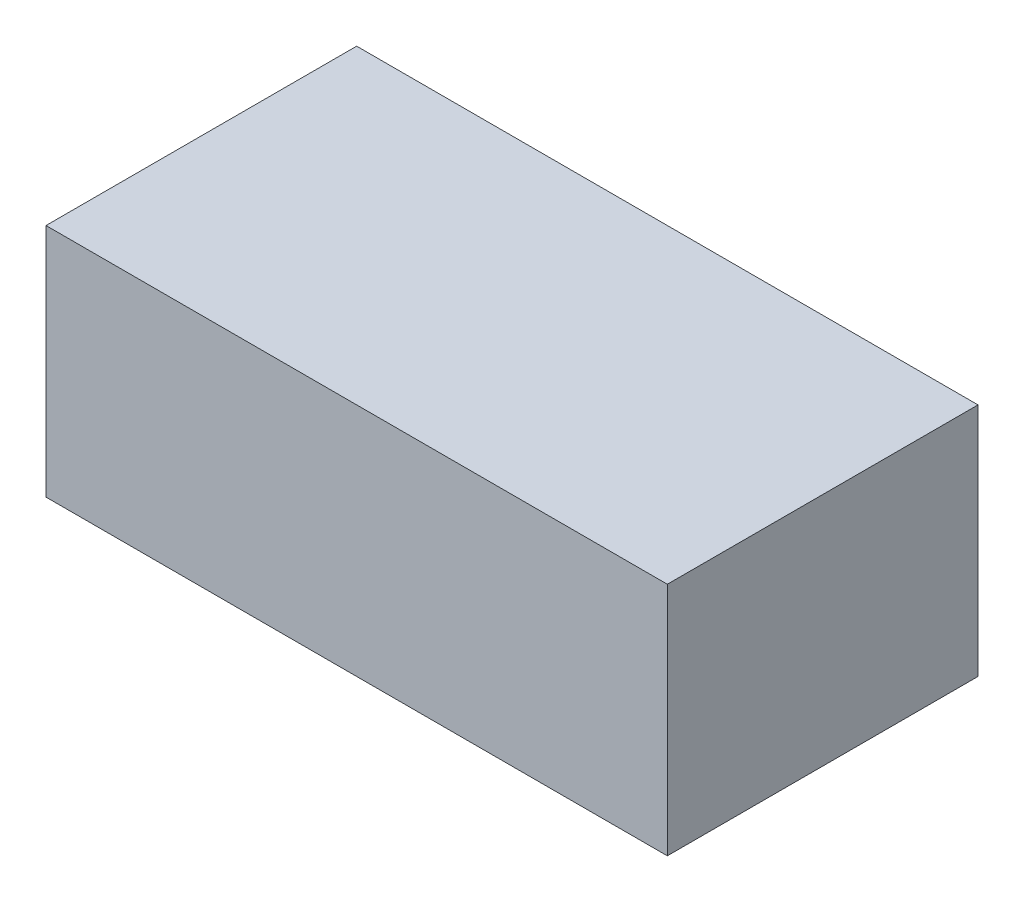
ISO-10303-21;
HEADER;
FILE_DESCRIPTION(('STEP AP214'),'2;1');
FILE_NAME('part.step','',(''),(''),'','','');
FILE_SCHEMA(('AUTOMOTIVE_DESIGN { 1 0 10303 214 1 1 1 1 }'));
ENDSEC;
DATA;
#1=APPLICATION_CONTEXT('core data for automotive mechanical design processes');
#2=APPLICATION_PROTOCOL_DEFINITION('international standard','automotive_design',2000,#1);
#3=PRODUCT_CONTEXT('',#1,'mechanical');
#4=PRODUCT('Part','Part','',(#3));
#5=PRODUCT_RELATED_PRODUCT_CATEGORY('part','',(#4));
#6=PRODUCT_DEFINITION_FORMATION('','',#4);
#7=PRODUCT_DEFINITION_CONTEXT('part definition',#1,'design');
#8=PRODUCT_DEFINITION('design','',#6,#7);
#9=PRODUCT_DEFINITION_SHAPE('','',#8);
#10=(LENGTH_UNIT() NAMED_UNIT(*) SI_UNIT(.MILLI.,.METRE.));
#11=(NAMED_UNIT(*) PLANE_ANGLE_UNIT() SI_UNIT($,.RADIAN.));
#12=(NAMED_UNIT(*) SI_UNIT($,.STERADIAN.) SOLID_ANGLE_UNIT());
#13=UNCERTAINTY_MEASURE_WITH_UNIT(LENGTH_MEASURE(1.E-05),#10,'distance_accuracy_value','');
#14=(GEOMETRIC_REPRESENTATION_CONTEXT(3) GLOBAL_UNCERTAINTY_ASSIGNED_CONTEXT((#13)) GLOBAL_UNIT_ASSIGNED_CONTEXT((#10,
#11,#12)) REPRESENTATION_CONTEXT('',''));
#15=CARTESIAN_POINT('',(0.,0.,0.));
#16=DIRECTION('',(0.,0.,1.));
#17=DIRECTION('',(1.,0.,0.));
#18=AXIS2_PLACEMENT_3D('',#15,#16,#17);
#19=CARTESIAN_POINT('',(70.,26.5,35.));
#20=DIRECTION('',(-1.,0.,0.));
#21=DIRECTION('',(0.,0.,1.));
#22=AXIS2_PLACEMENT_3D('',#19,#20,#21);
#23=PLANE('',#22);
#24=DIRECTION('',(0.,0.,-1.));
#25=VECTOR('',#24,1.);
#26=CARTESIAN_POINT('',(70.,-26.5,35.));
#27=LINE('',#26,#25);
#28=CARTESIAN_POINT('',(70.,-26.5,35.));
#29=VERTEX_POINT('',#28);
#30=CARTESIAN_POINT('',(70.,-26.5,-35.));
#31=VERTEX_POINT('',#30);
#32=EDGE_CURVE('E107',#29,#31,#27,.T.);
#33=ORIENTED_EDGE('',*,*,#32,.T.);
#34=DIRECTION('',(0.,-1.,0.));
#35=VECTOR('',#34,1.);
#36=CARTESIAN_POINT('',(70.,26.5,-35.));
#37=LINE('',#36,#35);
#38=CARTESIAN_POINT('',(70.,26.5,-35.));
#39=VERTEX_POINT('',#38);
#40=EDGE_CURVE('E11',#39,#31,#37,.T.);
#41=ORIENTED_EDGE('',*,*,#40,.F.);
#42=DIRECTION('',(0.,0.,-1.));
#43=VECTOR('',#42,1.);
#44=CARTESIAN_POINT('',(70.,26.5,35.));
#45=LINE('',#44,#43);
#46=CARTESIAN_POINT('',(70.,26.5,35.));
#47=VERTEX_POINT('',#46);
#48=EDGE_CURVE('E93',#47,#39,#45,.T.);
#49=ORIENTED_EDGE('',*,*,#48,.F.);
#50=DIRECTION('',(0.,-1.,0.));
#51=VECTOR('',#50,1.);
#52=CARTESIAN_POINT('',(70.,26.5,35.));
#53=LINE('',#52,#51);
#54=EDGE_CURVE('E103',#47,#29,#53,.T.);
#55=ORIENTED_EDGE('',*,*,#54,.T.);
#56=EDGE_LOOP('',(#33,#41,#49,#55));
#57=FACE_BOUND('',#56,.T.);
#58=ADVANCED_FACE('F41',(#57),#23,.F.);
#59=CARTESIAN_POINT('',(-70.,26.5,-35.));
#60=DIRECTION('',(0.,0.,1.));
#61=DIRECTION('',(1.,0.,0.));
#62=AXIS2_PLACEMENT_3D('',#59,#60,#61);
#63=PLANE('',#62);
#64=DIRECTION('',(-1.,0.,0.));
#65=VECTOR('',#64,1.);
#66=CARTESIAN_POINT('',(-70.,-26.5,-35.));
#67=LINE('',#66,#65);
#68=CARTESIAN_POINT('',(-70.,-26.5,-35.));
#69=VERTEX_POINT('',#68);
#70=EDGE_CURVE('E97',#31,#69,#67,.T.);
#71=ORIENTED_EDGE('',*,*,#70,.T.);
#72=DIRECTION('',(0.,-1.,0.));
#73=VECTOR('',#72,1.);
#74=CARTESIAN_POINT('',(-70.,26.5,-35.));
#75=LINE('',#74,#73);
#76=CARTESIAN_POINT('',(-70.,26.5,-35.));
#77=VERTEX_POINT('',#76);
#78=EDGE_CURVE('E49',#77,#69,#75,.T.);
#79=ORIENTED_EDGE('',*,*,#78,.F.);
#80=DIRECTION('',(-1.,0.,0.));
#81=VECTOR('',#80,1.);
#82=CARTESIAN_POINT('',(-70.,26.5,-35.));
#83=LINE('',#82,#81);
#84=EDGE_CURVE('E88',#39,#77,#83,.T.);
#85=ORIENTED_EDGE('',*,*,#84,.F.);
#86=ORIENTED_EDGE('',*,*,#40,.T.);
#87=EDGE_LOOP('',(#71,#79,#85,#86));
#88=FACE_BOUND('',#87,.T.);
#89=ADVANCED_FACE('F96',(#88),#63,.F.);
#90=CARTESIAN_POINT('',(-70.,26.5,35.));
#91=DIRECTION('',(1.,0.,0.));
#92=DIRECTION('',(0.,0.,-1.));
#93=AXIS2_PLACEMENT_3D('',#90,#91,#92);
#94=PLANE('',#93);
#95=DIRECTION('',(0.,0.,1.));
#96=VECTOR('',#95,1.);
#97=CARTESIAN_POINT('',(-70.,-26.5,35.));
#98=LINE('',#97,#96);
#99=CARTESIAN_POINT('',(-70.,-26.5,35.));
#100=VERTEX_POINT('',#99);
#101=EDGE_CURVE('E75',#69,#100,#98,.T.);
#102=ORIENTED_EDGE('',*,*,#101,.T.);
#103=DIRECTION('',(0.,-1.,0.));
#104=VECTOR('',#103,1.);
#105=CARTESIAN_POINT('',(-70.,26.5,35.));
#106=LINE('',#105,#104);
#107=CARTESIAN_POINT('',(-70.,26.5,35.));
#108=VERTEX_POINT('',#107);
#109=EDGE_CURVE('E98',#108,#100,#106,.T.);
#110=ORIENTED_EDGE('',*,*,#109,.F.);
#111=DIRECTION('',(0.,0.,1.));
#112=VECTOR('',#111,1.);
#113=CARTESIAN_POINT('',(-70.,26.5,35.));
#114=LINE('',#113,#112);
#115=EDGE_CURVE('E91',#77,#108,#114,.T.);
#116=ORIENTED_EDGE('',*,*,#115,.F.);
#117=ORIENTED_EDGE('',*,*,#78,.T.);
#118=EDGE_LOOP('',(#102,#110,#116,#117));
#119=FACE_BOUND('',#118,.T.);
#120=ADVANCED_FACE('F99',(#119),#94,.F.);
#121=CARTESIAN_POINT('',(-70.,26.5,35.));
#122=DIRECTION('',(0.,0.,-1.));
#123=DIRECTION('',(-1.,0.,0.));
#124=AXIS2_PLACEMENT_3D('',#121,#122,#123);
#125=PLANE('',#124);
#126=DIRECTION('',(1.,0.,0.));
#127=VECTOR('',#126,1.);
#128=CARTESIAN_POINT('',(-70.,-26.5,35.));
#129=LINE('',#128,#127);
#130=EDGE_CURVE('E81',#100,#29,#129,.T.);
#131=ORIENTED_EDGE('',*,*,#130,.T.);
#132=ORIENTED_EDGE('',*,*,#54,.F.);
#133=DIRECTION('',(1.,0.,0.));
#134=VECTOR('',#133,1.);
#135=CARTESIAN_POINT('',(-70.,26.5,35.));
#136=LINE('',#135,#134);
#137=EDGE_CURVE('E57',#108,#47,#136,.T.);
#138=ORIENTED_EDGE('',*,*,#137,.F.);
#139=ORIENTED_EDGE('',*,*,#109,.T.);
#140=EDGE_LOOP('',(#131,#132,#138,#139));
#141=FACE_BOUND('',#140,.T.);
#142=ADVANCED_FACE('F115',(#141),#125,.F.);
#143=CARTESIAN_POINT('',(0.,26.5,0.));
#144=DIRECTION('',(0.,-1.,0.));
#145=DIRECTION('',(0.,0.,-1.));
#146=AXIS2_PLACEMENT_3D('',#143,#144,#145);
#147=PLANE('',#146);
#148=ORIENTED_EDGE('',*,*,#48,.T.);
#149=ORIENTED_EDGE('',*,*,#84,.T.);
#150=ORIENTED_EDGE('',*,*,#115,.T.);
#151=ORIENTED_EDGE('',*,*,#137,.T.);
#152=EDGE_LOOP('',(#148,#149,#150,#151));
#153=FACE_BOUND('',#152,.T.);
#154=ADVANCED_FACE('F89',(#153),#147,.F.);
#155=CARTESIAN_POINT('',(0.,-26.5,0.));
#156=DIRECTION('',(0.,-1.,0.));
#157=DIRECTION('',(0.,0.,-1.));
#158=AXIS2_PLACEMENT_3D('',#155,#156,#157);
#159=PLANE('',#158);
#160=ORIENTED_EDGE('',*,*,#32,.F.);
#161=ORIENTED_EDGE('',*,*,#130,.F.);
#162=ORIENTED_EDGE('',*,*,#101,.F.);
#163=ORIENTED_EDGE('',*,*,#70,.F.);
#164=EDGE_LOOP('',(#160,#161,#162,#163));
#165=FACE_BOUND('',#164,.T.);
#166=ADVANCED_FACE('F118',(#165),#159,.T.);
#167=CLOSED_SHELL('',(#58,#89,#120,#142,#154,#166));
#168=MANIFOLD_SOLID_BREP('B2',#167);
#169=ADVANCED_BREP_SHAPE_REPRESENTATION('',(#18,#168),#14);
#170=SHAPE_DEFINITION_REPRESENTATION(#9,#169);
ENDSEC;
END-ISO-10303-21;
